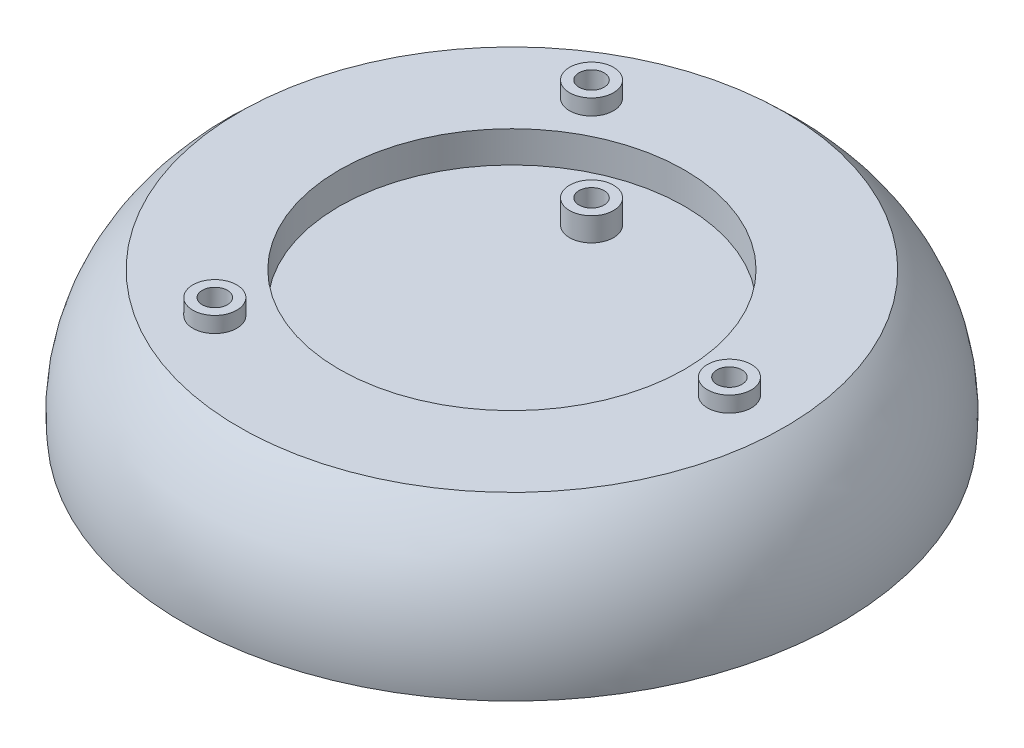
ISO-10303-21;
HEADER;
FILE_DESCRIPTION(('STEP AP214'),'2;1');
FILE_NAME('part.step','',(''),(''),'','','');
FILE_SCHEMA(('AUTOMOTIVE_DESIGN { 1 0 10303 214 1 1 1 1 }'));
ENDSEC;
DATA;
#1=APPLICATION_CONTEXT('core data for automotive mechanical design processes');
#2=APPLICATION_PROTOCOL_DEFINITION('international standard','automotive_design',2000,#1);
#3=PRODUCT_CONTEXT('',#1,'mechanical');
#4=PRODUCT('Part','Part','',(#3));
#5=PRODUCT_RELATED_PRODUCT_CATEGORY('part','',(#4));
#6=PRODUCT_DEFINITION_FORMATION('','',#4);
#7=PRODUCT_DEFINITION_CONTEXT('part definition',#1,'design');
#8=PRODUCT_DEFINITION('design','',#6,#7);
#9=PRODUCT_DEFINITION_SHAPE('','',#8);
#10=(LENGTH_UNIT() NAMED_UNIT(*) SI_UNIT(.MILLI.,.METRE.));
#11=(NAMED_UNIT(*) PLANE_ANGLE_UNIT() SI_UNIT($,.RADIAN.));
#12=(NAMED_UNIT(*) SI_UNIT($,.STERADIAN.) SOLID_ANGLE_UNIT());
#13=UNCERTAINTY_MEASURE_WITH_UNIT(LENGTH_MEASURE(1.E-05),#10,'distance_accuracy_value','');
#14=(GEOMETRIC_REPRESENTATION_CONTEXT(3) GLOBAL_UNCERTAINTY_ASSIGNED_CONTEXT((#13)) GLOBAL_UNIT_ASSIGNED_CONTEXT((#10,
#11,#12)) REPRESENTATION_CONTEXT('',''));
#15=CARTESIAN_POINT('',(0.,0.,0.));
#16=DIRECTION('',(0.,0.,1.));
#17=DIRECTION('',(1.,0.,0.));
#18=AXIS2_PLACEMENT_3D('',#15,#16,#17);
#19=CARTESIAN_POINT('',(0.,40.,85.));
#20=DIRECTION('',(0.,-1.,0.));
#21=DIRECTION('',(0.,0.,-1.));
#22=AXIS2_PLACEMENT_3D('',#19,#20,#21);
#23=PLANE('',#22);
#24=CARTESIAN_POINT('',(69.2820323027551,40.,0.));
#25=DIRECTION('',(0.,-1.,0.));
#26=DIRECTION('',(0.,0.,-1.));
#27=AXIS2_PLACEMENT_3D('',#24,#25,#26);
#28=CIRCLE('',#27,7.);
#29=CARTESIAN_POINT('',(69.2820323027551,40.,-7.));
#30=VERTEX_POINT('',#29);
#31=EDGE_CURVE('E65',#30,#30,#28,.F.);
#32=ORIENTED_EDGE('',*,*,#31,.F.);
#33=EDGE_LOOP('',(#32));
#34=FACE_BOUND('',#33,.T.);
#35=CARTESIAN_POINT('',(0.,40.,0.));
#36=DIRECTION('',(0.,-1.,0.));
#37=DIRECTION('',(0.,0.,-1.));
#38=AXIS2_PLACEMENT_3D('',#35,#36,#37);
#39=CIRCLE('',#38,55.);
#40=CARTESIAN_POINT('',(0.,40.,-55.));
#41=VERTEX_POINT('',#40);
#42=EDGE_CURVE('E101',#41,#41,#39,.T.);
#43=ORIENTED_EDGE('',*,*,#42,.T.);
#44=EDGE_LOOP('',(#43));
#45=FACE_BOUND('',#44,.T.);
#46=CARTESIAN_POINT('',(0.,40.,0.));
#47=DIRECTION('',(0.,-1.,0.));
#48=DIRECTION('',(0.,0.,-1.));
#49=AXIS2_PLACEMENT_3D('',#46,#47,#48);
#50=CIRCLE('',#49,86.9044142201699);
#51=CARTESIAN_POINT('',(0.,40.,-86.9044142201699));
#52=VERTEX_POINT('',#51);
#53=EDGE_CURVE('E105',#52,#52,#50,.T.);
#54=ORIENTED_EDGE('',*,*,#53,.F.);
#55=EDGE_LOOP('',(#54));
#56=FACE_BOUND('',#55,.T.);
#57=CARTESIAN_POINT('',(-34.6410161513775,40.,60.));
#58=DIRECTION('',(0.,-1.,0.));
#59=DIRECTION('',(0.,0.,-1.));
#60=AXIS2_PLACEMENT_3D('',#57,#58,#59);
#61=CIRCLE('',#60,6.99999999999999);
#62=CARTESIAN_POINT('',(-34.6410161513775,40.,53.));
#63=VERTEX_POINT('',#62);
#64=EDGE_CURVE('E70',#63,#63,#61,.F.);
#65=ORIENTED_EDGE('',*,*,#64,.F.);
#66=EDGE_LOOP('',(#65));
#67=FACE_BOUND('',#66,.T.);
#68=CARTESIAN_POINT('',(-34.6410161513775,40.,-60.));
#69=DIRECTION('',(0.,-1.,0.));
#70=DIRECTION('',(0.,0.,-1.));
#71=AXIS2_PLACEMENT_3D('',#68,#69,#70);
#72=CIRCLE('',#71,7.);
#73=CARTESIAN_POINT('',(-34.6410161513775,40.,-67.));
#74=VERTEX_POINT('',#73);
#75=EDGE_CURVE('E11',#74,#74,#72,.F.);
#76=ORIENTED_EDGE('',*,*,#75,.F.);
#77=EDGE_LOOP('',(#76));
#78=FACE_BOUND('',#77,.T.);
#79=ADVANCED_FACE('F57',(#34,#45,#56,#67,#78),#23,.F.);
#80=CARTESIAN_POINT('',(0.,-5.00000000000001,0.));
#81=DIRECTION('',(0.,1.,0.));
#82=DIRECTION('',(0.,0.,1.));
#83=AXIS2_PLACEMENT_3D('',#80,#81,#82);
#84=PLANE('',#83);
#85=CARTESIAN_POINT('',(0.,-5.00000000000001,0.));
#86=DIRECTION('',(0.,-1.,0.));
#87=DIRECTION('',(0.,0.,-1.));
#88=AXIS2_PLACEMENT_3D('',#85,#86,#87);
#89=CIRCLE('',#88,104.698104926141);
#90=CARTESIAN_POINT('',(0.,-5.00000000000001,-104.698104926141));
#91=VERTEX_POINT('',#90);
#92=EDGE_CURVE('E109',#91,#91,#89,.T.);
#93=ORIENTED_EDGE('',*,*,#92,.T.);
#94=EDGE_LOOP('',(#93));
#95=FACE_BOUND('',#94,.T.);
#96=ADVANCED_FACE('F59',(#95),#84,.F.);
#97=CARTESIAN_POINT('',(0.,4.99999999999999,0.));
#98=DIRECTION('',(0.,1.,0.));
#99=DIRECTION('',(0.,0.,1.));
#100=AXIS2_PLACEMENT_3D('',#97,#98,#99);
#101=PLANE('',#100);
#102=CARTESIAN_POINT('',(69.2820323027551,4.99999999999999,0.));
#103=DIRECTION('',(0.,1.,0.));
#104=DIRECTION('',(0.,0.,1.));
#105=AXIS2_PLACEMENT_3D('',#102,#103,#104);
#106=CIRCLE('',#105,7.);
#107=CARTESIAN_POINT('',(69.2820323027551,4.99999999999999,7.));
#108=VERTEX_POINT('',#107);
#109=EDGE_CURVE('E150',#108,#108,#106,.T.);
#110=ORIENTED_EDGE('',*,*,#109,.F.);
#111=EDGE_LOOP('',(#110));
#112=FACE_BOUND('',#111,.T.);
#113=CARTESIAN_POINT('',(-34.6410161513775,4.99999999999999,60.));
#114=DIRECTION('',(0.,1.,0.));
#115=DIRECTION('',(0.,0.,1.));
#116=AXIS2_PLACEMENT_3D('',#113,#114,#115);
#117=CIRCLE('',#116,7.);
#118=CARTESIAN_POINT('',(-34.6410161513775,4.99999999999999,67.));
#119=VERTEX_POINT('',#118);
#120=EDGE_CURVE('E138',#119,#119,#117,.T.);
#121=ORIENTED_EDGE('',*,*,#120,.F.);
#122=EDGE_LOOP('',(#121));
#123=FACE_BOUND('',#122,.T.);
#124=CARTESIAN_POINT('',(-34.6410161513775,4.99999999999999,-60.));
#125=DIRECTION('',(0.,1.,0.));
#126=DIRECTION('',(0.,0.,1.));
#127=AXIS2_PLACEMENT_3D('',#124,#125,#126);
#128=CIRCLE('',#127,7.);
#129=CARTESIAN_POINT('',(-34.6410161513775,4.99999999999999,-53.));
#130=VERTEX_POINT('',#129);
#131=EDGE_CURVE('E126',#130,#130,#128,.T.);
#132=ORIENTED_EDGE('',*,*,#131,.F.);
#133=EDGE_LOOP('',(#132));
#134=FACE_BOUND('',#133,.T.);
#135=CARTESIAN_POINT('',(0.,4.99999999999999,0.));
#136=DIRECTION('',(0.,-1.,0.));
#137=DIRECTION('',(0.,0.,-1.));
#138=AXIS2_PLACEMENT_3D('',#135,#136,#137);
#139=CIRCLE('',#138,94.7752253502163);
#140=CARTESIAN_POINT('',(0.,4.99999999999999,-94.7752253502163));
#141=VERTEX_POINT('',#140);
#142=EDGE_CURVE('E89',#141,#141,#139,.T.);
#143=ORIENTED_EDGE('',*,*,#142,.F.);
#144=EDGE_LOOP('',(#143));
#145=FACE_BOUND('',#144,.T.);
#146=ADVANCED_FACE('F203',(#112,#123,#134,#145),#101,.T.);
#147=CARTESIAN_POINT('',(0.,0.626963776190752,0.));
#148=DIRECTION('',(0.,-1.,0.));
#149=DIRECTION('',(0.,0.,-1.));
#150=AXIS2_PLACEMENT_3D('',#147,#148,#149);
#151=TOROIDAL_SURFACE('',#150,53.1295821444451,41.8746109693827);
#152=ORIENTED_EDGE('',*,*,#142,.T.);
#153=EDGE_LOOP('',(#152));
#154=FACE_BOUND('',#153,.T.);
#155=CARTESIAN_POINT('',(0.,30.,0.));
#156=DIRECTION('',(0.,-1.,0.));
#157=DIRECTION('',(0.,0.,-1.));
#158=AXIS2_PLACEMENT_3D('',#155,#156,#157);
#159=CIRCLE('',#158,82.9743101015222);
#160=CARTESIAN_POINT('',(0.,30.,-82.9743101015222));
#161=VERTEX_POINT('',#160);
#162=EDGE_CURVE('E93',#161,#161,#159,.T.);
#163=ORIENTED_EDGE('',*,*,#162,.F.);
#164=EDGE_LOOP('',(#163));
#165=FACE_BOUND('',#164,.T.);
#166=ADVANCED_FACE('F217',(#154,#165),#151,.F.);
#167=CARTESIAN_POINT('',(0.,30.,85.));
#168=DIRECTION('',(0.,-1.,0.));
#169=DIRECTION('',(0.,0.,-1.));
#170=AXIS2_PLACEMENT_3D('',#167,#168,#169);
#171=PLANE('',#170);
#172=CARTESIAN_POINT('',(69.2820323027551,30.,0.));
#173=DIRECTION('',(0.,-1.,0.));
#174=DIRECTION('',(0.,0.,-1.));
#175=AXIS2_PLACEMENT_3D('',#172,#173,#174);
#176=CIRCLE('',#175,4.00000000000001);
#177=CARTESIAN_POINT('',(69.2820323027551,30.,-4.00000000000001));
#178=VERTEX_POINT('',#177);
#179=EDGE_CURVE('E113',#178,#178,#176,.F.);
#180=ORIENTED_EDGE('',*,*,#179,.T.);
#181=EDGE_LOOP('',(#180));
#182=FACE_BOUND('',#181,.T.);
#183=CARTESIAN_POINT('',(-34.6410161513775,30.,-60.));
#184=DIRECTION('',(0.,-1.,0.));
#185=DIRECTION('',(0.,0.,-1.));
#186=AXIS2_PLACEMENT_3D('',#183,#184,#185);
#187=CIRCLE('',#186,4.);
#188=CARTESIAN_POINT('',(-34.6410161513775,30.,-64.));
#189=VERTEX_POINT('',#188);
#190=EDGE_CURVE('E117',#189,#189,#187,.F.);
#191=ORIENTED_EDGE('',*,*,#190,.T.);
#192=EDGE_LOOP('',(#191));
#193=FACE_BOUND('',#192,.T.);
#194=CARTESIAN_POINT('',(-34.6410161513775,30.,60.));
#195=DIRECTION('',(0.,-1.,0.));
#196=DIRECTION('',(0.,0.,-1.));
#197=AXIS2_PLACEMENT_3D('',#194,#195,#196);
#198=CIRCLE('',#197,4.);
#199=CARTESIAN_POINT('',(-34.6410161513775,30.,56.));
#200=VERTEX_POINT('',#199);
#201=EDGE_CURVE('E121',#200,#200,#198,.F.);
#202=ORIENTED_EDGE('',*,*,#201,.T.);
#203=EDGE_LOOP('',(#202));
#204=FACE_BOUND('',#203,.T.);
#205=ORIENTED_EDGE('',*,*,#162,.T.);
#206=EDGE_LOOP('',(#205));
#207=FACE_BOUND('',#206,.T.);
#208=CARTESIAN_POINT('',(0.,30.,0.));
#209=DIRECTION('',(0.,-1.,0.));
#210=DIRECTION('',(0.,0.,-1.));
#211=AXIS2_PLACEMENT_3D('',#208,#209,#210);
#212=CIRCLE('',#211,55.);
#213=CARTESIAN_POINT('',(0.,30.,-55.));
#214=VERTEX_POINT('',#213);
#215=EDGE_CURVE('E97',#214,#214,#212,.T.);
#216=ORIENTED_EDGE('',*,*,#215,.F.);
#217=EDGE_LOOP('',(#216));
#218=FACE_BOUND('',#217,.T.);
#219=ADVANCED_FACE('F213',(#182,#193,#204,#207,#218),#171,.T.);
#220=CARTESIAN_POINT('',(0.,0.,0.));
#221=DIRECTION('',(0.,-1.,0.));
#222=DIRECTION('',(0.,0.,-1.));
#223=AXIS2_PLACEMENT_3D('',#220,#221,#222);
#224=CYLINDRICAL_SURFACE('',#223,55.);
#225=ORIENTED_EDGE('',*,*,#215,.T.);
#226=EDGE_LOOP('',(#225));
#227=FACE_BOUND('',#226,.T.);
#228=ORIENTED_EDGE('',*,*,#42,.F.);
#229=EDGE_LOOP('',(#228));
#230=FACE_BOUND('',#229,.T.);
#231=ADVANCED_FACE('F210',(#227,#230),#224,.F.);
#232=CARTESIAN_POINT('',(0.,0.626963776190752,0.));
#233=DIRECTION('',(0.,-1.,0.));
#234=DIRECTION('',(0.,0.,-1.));
#235=AXIS2_PLACEMENT_3D('',#232,#233,#234);
#236=TOROIDAL_SURFACE('',#235,53.1295821444451,51.8746109693827);
#237=ORIENTED_EDGE('',*,*,#92,.F.);
#238=EDGE_LOOP('',(#237));
#239=FACE_BOUND('',#238,.T.);
#240=ORIENTED_EDGE('',*,*,#53,.T.);
#241=EDGE_LOOP('',(#240));
#242=FACE_BOUND('',#241,.T.);
#243=ADVANCED_FACE('F208',(#239,#242),#236,.T.);
#244=CARTESIAN_POINT('',(-34.6410161513775,51.3137084989848,60.));
#245=DIRECTION('',(0.,-1.,0.));
#246=DIRECTION('',(0.,0.,-1.));
#247=AXIS2_PLACEMENT_3D('',#244,#245,#246);
#248=CYLINDRICAL_SURFACE('',#247,4.);
#249=ORIENTED_EDGE('',*,*,#201,.F.);
#250=EDGE_LOOP('',(#249));
#251=FACE_BOUND('',#250,.T.);
#252=CARTESIAN_POINT('',(-34.6410161513775,45.,60.));
#253=DIRECTION('',(0.,1.,0.));
#254=DIRECTION('',(0.,0.,1.));
#255=AXIS2_PLACEMENT_3D('',#252,#253,#254);
#256=CIRCLE('',#255,4.);
#257=CARTESIAN_POINT('',(-34.6410161513775,45.,64.));
#258=VERTEX_POINT('',#257);
#259=EDGE_CURVE('E165',#258,#258,#256,.T.);
#260=ORIENTED_EDGE('',*,*,#259,.T.);
#261=EDGE_LOOP('',(#260));
#262=FACE_BOUND('',#261,.T.);
#263=ADVANCED_FACE('F284',(#251,#262),#248,.F.);
#264=CARTESIAN_POINT('',(-34.6410161513775,51.3137084989848,-60.));
#265=DIRECTION('',(0.,-1.,0.));
#266=DIRECTION('',(0.,0.,-1.));
#267=AXIS2_PLACEMENT_3D('',#264,#265,#266);
#268=CYLINDRICAL_SURFACE('',#267,4.);
#269=ORIENTED_EDGE('',*,*,#190,.F.);
#270=EDGE_LOOP('',(#269));
#271=FACE_BOUND('',#270,.T.);
#272=CARTESIAN_POINT('',(-34.6410161513775,45.,-60.));
#273=DIRECTION('',(0.,1.,0.));
#274=DIRECTION('',(0.,0.,1.));
#275=AXIS2_PLACEMENT_3D('',#272,#273,#274);
#276=CIRCLE('',#275,4.);
#277=CARTESIAN_POINT('',(-34.6410161513775,45.,-56.));
#278=VERTEX_POINT('',#277);
#279=EDGE_CURVE('E177',#278,#278,#276,.T.);
#280=ORIENTED_EDGE('',*,*,#279,.T.);
#281=EDGE_LOOP('',(#280));
#282=FACE_BOUND('',#281,.T.);
#283=ADVANCED_FACE('F281',(#271,#282),#268,.F.);
#284=CARTESIAN_POINT('',(69.2820323027551,51.3137084989848,0.));
#285=DIRECTION('',(0.,-1.,0.));
#286=DIRECTION('',(0.,0.,-1.));
#287=AXIS2_PLACEMENT_3D('',#284,#285,#286);
#288=CYLINDRICAL_SURFACE('',#287,4.00000000000001);
#289=ORIENTED_EDGE('',*,*,#179,.F.);
#290=EDGE_LOOP('',(#289));
#291=FACE_BOUND('',#290,.T.);
#292=CARTESIAN_POINT('',(69.2820323027551,45.,0.));
#293=DIRECTION('',(0.,1.,0.));
#294=DIRECTION('',(0.,0.,1.));
#295=AXIS2_PLACEMENT_3D('',#292,#293,#294);
#296=CIRCLE('',#295,4.00000000000001);
#297=CARTESIAN_POINT('',(69.2820323027551,45.,4.00000000000001));
#298=VERTEX_POINT('',#297);
#299=EDGE_CURVE('E169',#298,#298,#296,.T.);
#300=ORIENTED_EDGE('',*,*,#299,.T.);
#301=EDGE_LOOP('',(#300));
#302=FACE_BOUND('',#301,.T.);
#303=ADVANCED_FACE('F274',(#291,#302),#288,.F.);
#304=CARTESIAN_POINT('',(-34.6410161513775,12.5,-60.));
#305=DIRECTION('',(0.,1.,0.));
#306=DIRECTION('',(0.,0.,1.));
#307=AXIS2_PLACEMENT_3D('',#304,#305,#306);
#308=PLANE('',#307);
#309=CARTESIAN_POINT('',(-34.6410161513775,12.5,-60.));
#310=DIRECTION('',(0.,1.,0.));
#311=DIRECTION('',(0.,0.,1.));
#312=AXIS2_PLACEMENT_3D('',#309,#310,#311);
#313=CIRCLE('',#312,7.);
#314=CARTESIAN_POINT('',(-34.6410161513775,12.5,-53.));
#315=VERTEX_POINT('',#314);
#316=EDGE_CURVE('E125',#315,#315,#313,.T.);
#317=ORIENTED_EDGE('',*,*,#316,.T.);
#318=EDGE_LOOP('',(#317));
#319=FACE_BOUND('',#318,.T.);
#320=CARTESIAN_POINT('',(-34.6410161513775,12.5,-60.));
#321=DIRECTION('',(0.,1.,0.));
#322=DIRECTION('',(0.,0.,1.));
#323=AXIS2_PLACEMENT_3D('',#320,#321,#322);
#324=CIRCLE('',#323,4.);
#325=CARTESIAN_POINT('',(-34.6410161513775,12.5,-56.));
#326=VERTEX_POINT('',#325);
#327=EDGE_CURVE('E130',#326,#326,#324,.T.);
#328=ORIENTED_EDGE('',*,*,#327,.F.);
#329=EDGE_LOOP('',(#328));
#330=FACE_BOUND('',#329,.T.);
#331=ADVANCED_FACE('F271',(#319,#330),#308,.T.);
#332=CARTESIAN_POINT('',(-34.6410161513775,12.5,-60.));
#333=DIRECTION('',(0.,-1.,0.));
#334=DIRECTION('',(0.,0.,-1.));
#335=AXIS2_PLACEMENT_3D('',#332,#333,#334);
#336=CYLINDRICAL_SURFACE('',#335,7.);
#337=ORIENTED_EDGE('',*,*,#316,.F.);
#338=EDGE_LOOP('',(#337));
#339=FACE_BOUND('',#338,.T.);
#340=ORIENTED_EDGE('',*,*,#131,.T.);
#341=EDGE_LOOP('',(#340));
#342=FACE_BOUND('',#341,.T.);
#343=ADVANCED_FACE('F245',(#339,#342),#336,.T.);
#344=CARTESIAN_POINT('',(-34.6410161513775,12.5,-60.));
#345=DIRECTION('',(0.,-1.,0.));
#346=DIRECTION('',(0.,0.,-1.));
#347=AXIS2_PLACEMENT_3D('',#344,#345,#346);
#348=CYLINDRICAL_SURFACE('',#347,4.);
#349=ORIENTED_EDGE('',*,*,#327,.T.);
#350=EDGE_LOOP('',(#349));
#351=FACE_BOUND('',#350,.T.);
#352=CARTESIAN_POINT('',(-34.6410161513775,4.99999999999999,-60.));
#353=DIRECTION('',(0.,1.,0.));
#354=DIRECTION('',(0.,0.,1.));
#355=AXIS2_PLACEMENT_3D('',#352,#353,#354);
#356=CIRCLE('',#355,4.);
#357=CARTESIAN_POINT('',(-34.6410161513775,4.99999999999999,-56.));
#358=VERTEX_POINT('',#357);
#359=EDGE_CURVE('E85',#358,#358,#356,.F.);
#360=ORIENTED_EDGE('',*,*,#359,.T.);
#361=EDGE_LOOP('',(#360));
#362=FACE_BOUND('',#361,.T.);
#363=ADVANCED_FACE('F236',(#351,#362),#348,.F.);
#364=ORIENTED_EDGE('',*,*,#359,.F.);
#365=EDGE_LOOP('',(#364));
#366=FACE_BOUND('',#365,.T.);
#367=ADVANCED_FACE('F224',(#366),#101,.T.);
#368=CARTESIAN_POINT('',(-34.6410161513775,12.5,60.));
#369=DIRECTION('',(0.,1.,0.));
#370=DIRECTION('',(0.,0.,1.));
#371=AXIS2_PLACEMENT_3D('',#368,#369,#370);
#372=PLANE('',#371);
#373=CARTESIAN_POINT('',(-34.6410161513775,12.5,60.));
#374=DIRECTION('',(0.,1.,0.));
#375=DIRECTION('',(0.,0.,1.));
#376=AXIS2_PLACEMENT_3D('',#373,#374,#375);
#377=CIRCLE('',#376,7.);
#378=CARTESIAN_POINT('',(-34.6410161513775,12.5,67.));
#379=VERTEX_POINT('',#378);
#380=EDGE_CURVE('E137',#379,#379,#377,.T.);
#381=ORIENTED_EDGE('',*,*,#380,.T.);
#382=EDGE_LOOP('',(#381));
#383=FACE_BOUND('',#382,.T.);
#384=CARTESIAN_POINT('',(-34.6410161513775,12.5,60.));
#385=DIRECTION('',(0.,1.,0.));
#386=DIRECTION('',(0.,0.,1.));
#387=AXIS2_PLACEMENT_3D('',#384,#385,#386);
#388=CIRCLE('',#387,4.);
#389=CARTESIAN_POINT('',(-34.6410161513775,12.5,64.));
#390=VERTEX_POINT('',#389);
#391=EDGE_CURVE('E142',#390,#390,#388,.T.);
#392=ORIENTED_EDGE('',*,*,#391,.F.);
#393=EDGE_LOOP('',(#392));
#394=FACE_BOUND('',#393,.T.);
#395=ADVANCED_FACE('F235',(#383,#394),#372,.T.);
#396=CARTESIAN_POINT('',(-34.6410161513775,12.5,60.));
#397=DIRECTION('',(0.,-1.,0.));
#398=DIRECTION('',(0.,0.,-1.));
#399=AXIS2_PLACEMENT_3D('',#396,#397,#398);
#400=CYLINDRICAL_SURFACE('',#399,7.);
#401=ORIENTED_EDGE('',*,*,#380,.F.);
#402=EDGE_LOOP('',(#401));
#403=FACE_BOUND('',#402,.T.);
#404=ORIENTED_EDGE('',*,*,#120,.T.);
#405=EDGE_LOOP('',(#404));
#406=FACE_BOUND('',#405,.T.);
#407=ADVANCED_FACE('F242',(#403,#406),#400,.T.);
#408=CARTESIAN_POINT('',(-34.6410161513775,12.5,60.));
#409=DIRECTION('',(0.,-1.,0.));
#410=DIRECTION('',(0.,0.,-1.));
#411=AXIS2_PLACEMENT_3D('',#408,#409,#410);
#412=CYLINDRICAL_SURFACE('',#411,4.);
#413=ORIENTED_EDGE('',*,*,#391,.T.);
#414=EDGE_LOOP('',(#413));
#415=FACE_BOUND('',#414,.T.);
#416=CARTESIAN_POINT('',(-34.6410161513775,4.99999999999999,60.));
#417=DIRECTION('',(0.,1.,0.));
#418=DIRECTION('',(0.,0.,1.));
#419=AXIS2_PLACEMENT_3D('',#416,#417,#418);
#420=CIRCLE('',#419,4.);
#421=CARTESIAN_POINT('',(-34.6410161513775,4.99999999999999,64.));
#422=VERTEX_POINT('',#421);
#423=EDGE_CURVE('E81',#422,#422,#420,.F.);
#424=ORIENTED_EDGE('',*,*,#423,.T.);
#425=EDGE_LOOP('',(#424));
#426=FACE_BOUND('',#425,.T.);
#427=ADVANCED_FACE('F251',(#415,#426),#412,.F.);
#428=ORIENTED_EDGE('',*,*,#423,.F.);
#429=EDGE_LOOP('',(#428));
#430=FACE_BOUND('',#429,.T.);
#431=ADVANCED_FACE('F233',(#430),#101,.T.);
#432=CARTESIAN_POINT('',(69.2820323027551,12.5,0.));
#433=DIRECTION('',(0.,1.,0.));
#434=DIRECTION('',(0.,0.,1.));
#435=AXIS2_PLACEMENT_3D('',#432,#433,#434);
#436=PLANE('',#435);
#437=CARTESIAN_POINT('',(69.2820323027551,12.5,0.));
#438=DIRECTION('',(0.,1.,0.));
#439=DIRECTION('',(0.,0.,1.));
#440=AXIS2_PLACEMENT_3D('',#437,#438,#439);
#441=CIRCLE('',#440,7.);
#442=CARTESIAN_POINT('',(69.2820323027551,12.5,7.));
#443=VERTEX_POINT('',#442);
#444=EDGE_CURVE('E149',#443,#443,#441,.T.);
#445=ORIENTED_EDGE('',*,*,#444,.T.);
#446=EDGE_LOOP('',(#445));
#447=FACE_BOUND('',#446,.T.);
#448=CARTESIAN_POINT('',(69.2820323027551,12.5,0.));
#449=DIRECTION('',(0.,1.,0.));
#450=DIRECTION('',(0.,0.,1.));
#451=AXIS2_PLACEMENT_3D('',#448,#449,#450);
#452=CIRCLE('',#451,4.00000000000001);
#453=CARTESIAN_POINT('',(69.2820323027551,12.5,4.00000000000001));
#454=VERTEX_POINT('',#453);
#455=EDGE_CURVE('E154',#454,#454,#452,.T.);
#456=ORIENTED_EDGE('',*,*,#455,.F.);
#457=EDGE_LOOP('',(#456));
#458=FACE_BOUND('',#457,.T.);
#459=ADVANCED_FACE('F250',(#447,#458),#436,.T.);
#460=CARTESIAN_POINT('',(69.2820323027551,12.5,0.));
#461=DIRECTION('',(0.,-1.,0.));
#462=DIRECTION('',(0.,0.,-1.));
#463=AXIS2_PLACEMENT_3D('',#460,#461,#462);
#464=CYLINDRICAL_SURFACE('',#463,7.);
#465=ORIENTED_EDGE('',*,*,#444,.F.);
#466=EDGE_LOOP('',(#465));
#467=FACE_BOUND('',#466,.T.);
#468=ORIENTED_EDGE('',*,*,#109,.T.);
#469=EDGE_LOOP('',(#468));
#470=FACE_BOUND('',#469,.T.);
#471=ADVANCED_FACE('F257',(#467,#470),#464,.T.);
#472=CARTESIAN_POINT('',(69.2820323027551,12.5,0.));
#473=DIRECTION('',(0.,-1.,0.));
#474=DIRECTION('',(0.,0.,-1.));
#475=AXIS2_PLACEMENT_3D('',#472,#473,#474);
#476=CYLINDRICAL_SURFACE('',#475,4.00000000000001);
#477=ORIENTED_EDGE('',*,*,#455,.T.);
#478=EDGE_LOOP('',(#477));
#479=FACE_BOUND('',#478,.T.);
#480=CARTESIAN_POINT('',(69.2820323027551,4.99999999999999,0.));
#481=DIRECTION('',(0.,1.,0.));
#482=DIRECTION('',(0.,0.,1.));
#483=AXIS2_PLACEMENT_3D('',#480,#481,#482);
#484=CIRCLE('',#483,4.00000000000001);
#485=CARTESIAN_POINT('',(69.2820323027551,4.99999999999999,4.00000000000001));
#486=VERTEX_POINT('',#485);
#487=EDGE_CURVE('E75',#486,#486,#484,.F.);
#488=ORIENTED_EDGE('',*,*,#487,.T.);
#489=EDGE_LOOP('',(#488));
#490=FACE_BOUND('',#489,.T.);
#491=ADVANCED_FACE('F231',(#479,#490),#476,.F.);
#492=ORIENTED_EDGE('',*,*,#487,.F.);
#493=EDGE_LOOP('',(#492));
#494=FACE_BOUND('',#493,.T.);
#495=ADVANCED_FACE('F223',(#494),#101,.T.);
#496=CARTESIAN_POINT('',(-34.6410161513775,45.,60.));
#497=DIRECTION('',(0.,1.,0.));
#498=DIRECTION('',(0.,0.,1.));
#499=AXIS2_PLACEMENT_3D('',#496,#497,#498);
#500=PLANE('',#499);
#501=CARTESIAN_POINT('',(-34.6410161513775,45.,60.));
#502=DIRECTION('',(0.,1.,0.));
#503=DIRECTION('',(0.,0.,1.));
#504=AXIS2_PLACEMENT_3D('',#501,#502,#503);
#505=CIRCLE('',#504,6.99999999999999);
#506=CARTESIAN_POINT('',(-34.6410161513775,45.,67.));
#507=VERTEX_POINT('',#506);
#508=EDGE_CURVE('E161',#507,#507,#505,.T.);
#509=ORIENTED_EDGE('',*,*,#508,.T.);
#510=EDGE_LOOP('',(#509));
#511=FACE_BOUND('',#510,.T.);
#512=ORIENTED_EDGE('',*,*,#259,.F.);
#513=EDGE_LOOP('',(#512));
#514=FACE_BOUND('',#513,.T.);
#515=ADVANCED_FACE('F230',(#511,#514),#500,.T.);
#516=CARTESIAN_POINT('',(-34.6410161513775,45.,60.));
#517=DIRECTION('',(0.,-1.,0.));
#518=DIRECTION('',(0.,0.,-1.));
#519=AXIS2_PLACEMENT_3D('',#516,#517,#518);
#520=CYLINDRICAL_SURFACE('',#519,6.99999999999999);
#521=ORIENTED_EDGE('',*,*,#508,.F.);
#522=EDGE_LOOP('',(#521));
#523=FACE_BOUND('',#522,.T.);
#524=ORIENTED_EDGE('',*,*,#64,.T.);
#525=EDGE_LOOP('',(#524));
#526=FACE_BOUND('',#525,.T.);
#527=ADVANCED_FACE('F297',(#523,#526),#520,.T.);
#528=CARTESIAN_POINT('',(69.2820323027551,45.,0.));
#529=DIRECTION('',(0.,1.,0.));
#530=DIRECTION('',(0.,0.,1.));
#531=AXIS2_PLACEMENT_3D('',#528,#529,#530);
#532=PLANE('',#531);
#533=CARTESIAN_POINT('',(69.2820323027551,45.,0.));
#534=DIRECTION('',(0.,1.,0.));
#535=DIRECTION('',(0.,0.,1.));
#536=AXIS2_PLACEMENT_3D('',#533,#534,#535);
#537=CIRCLE('',#536,7.);
#538=CARTESIAN_POINT('',(69.2820323027551,45.,7.));
#539=VERTEX_POINT('',#538);
#540=EDGE_CURVE('E173',#539,#539,#537,.T.);
#541=ORIENTED_EDGE('',*,*,#540,.T.);
#542=EDGE_LOOP('',(#541));
#543=FACE_BOUND('',#542,.T.);
#544=ORIENTED_EDGE('',*,*,#299,.F.);
#545=EDGE_LOOP('',(#544));
#546=FACE_BOUND('',#545,.T.);
#547=ADVANCED_FACE('F303',(#543,#546),#532,.T.);
#548=CARTESIAN_POINT('',(69.2820323027551,45.,0.));
#549=DIRECTION('',(0.,-1.,0.));
#550=DIRECTION('',(0.,0.,-1.));
#551=AXIS2_PLACEMENT_3D('',#548,#549,#550);
#552=CYLINDRICAL_SURFACE('',#551,7.);
#553=ORIENTED_EDGE('',*,*,#540,.F.);
#554=EDGE_LOOP('',(#553));
#555=FACE_BOUND('',#554,.T.);
#556=ORIENTED_EDGE('',*,*,#31,.T.);
#557=EDGE_LOOP('',(#556));
#558=FACE_BOUND('',#557,.T.);
#559=ADVANCED_FACE('F195',(#555,#558),#552,.T.);
#560=CARTESIAN_POINT('',(-34.6410161513775,45.,-60.));
#561=DIRECTION('',(0.,1.,0.));
#562=DIRECTION('',(0.,0.,1.));
#563=AXIS2_PLACEMENT_3D('',#560,#561,#562);
#564=PLANE('',#563);
#565=CARTESIAN_POINT('',(-34.6410161513775,45.,-60.));
#566=DIRECTION('',(0.,1.,0.));
#567=DIRECTION('',(0.,0.,1.));
#568=AXIS2_PLACEMENT_3D('',#565,#566,#567);
#569=CIRCLE('',#568,7.);
#570=CARTESIAN_POINT('',(-34.6410161513775,45.,-53.));
#571=VERTEX_POINT('',#570);
#572=EDGE_CURVE('E181',#571,#571,#569,.T.);
#573=ORIENTED_EDGE('',*,*,#572,.T.);
#574=EDGE_LOOP('',(#573));
#575=FACE_BOUND('',#574,.T.);
#576=ORIENTED_EDGE('',*,*,#279,.F.);
#577=EDGE_LOOP('',(#576));
#578=FACE_BOUND('',#577,.T.);
#579=ADVANCED_FACE('F186',(#575,#578),#564,.T.);
#580=CARTESIAN_POINT('',(-34.6410161513775,45.,-60.));
#581=DIRECTION('',(0.,-1.,0.));
#582=DIRECTION('',(0.,0.,-1.));
#583=AXIS2_PLACEMENT_3D('',#580,#581,#582);
#584=CYLINDRICAL_SURFACE('',#583,7.);
#585=ORIENTED_EDGE('',*,*,#572,.F.);
#586=EDGE_LOOP('',(#585));
#587=FACE_BOUND('',#586,.T.);
#588=ORIENTED_EDGE('',*,*,#75,.T.);
#589=EDGE_LOOP('',(#588));
#590=FACE_BOUND('',#589,.T.);
#591=ADVANCED_FACE('F189',(#587,#590),#584,.T.);
#592=CLOSED_SHELL('',(#79,#96,#146,#166,#219,#231,#243,#263,#283,#303,#331,#343,#363,#367,#395,
#407,#427,#431,#459,#471,#491,#495,#515,#527,#547,#559,#579,#591));
#593=MANIFOLD_SOLID_BREP('B2',#592);
#594=ADVANCED_BREP_SHAPE_REPRESENTATION('',(#18,#593),#14);
#595=SHAPE_DEFINITION_REPRESENTATION(#9,#594);
ENDSEC;
END-ISO-10303-21;
